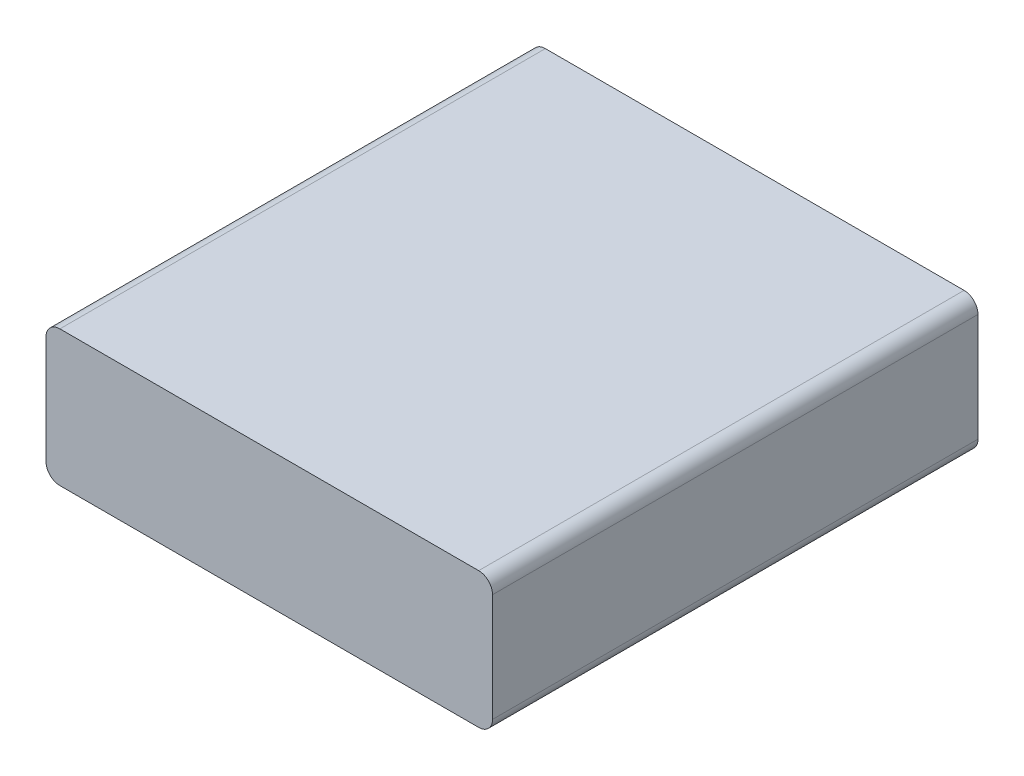
ISO-10303-21;
HEADER;
FILE_DESCRIPTION(('STEP AP214'),'2;1');
FILE_NAME('part.step','',(''),(''),'','','');
FILE_SCHEMA(('AUTOMOTIVE_DESIGN { 1 0 10303 214 1 1 1 1 }'));
ENDSEC;
DATA;
#1=APPLICATION_CONTEXT('core data for automotive mechanical design processes');
#2=APPLICATION_PROTOCOL_DEFINITION('international standard','automotive_design',2000,#1);
#3=PRODUCT_CONTEXT('',#1,'mechanical');
#4=PRODUCT('Part','Part','',(#3));
#5=PRODUCT_RELATED_PRODUCT_CATEGORY('part','',(#4));
#6=PRODUCT_DEFINITION_FORMATION('','',#4);
#7=PRODUCT_DEFINITION_CONTEXT('part definition',#1,'design');
#8=PRODUCT_DEFINITION('design','',#6,#7);
#9=PRODUCT_DEFINITION_SHAPE('','',#8);
#10=(LENGTH_UNIT() NAMED_UNIT(*) SI_UNIT(.MILLI.,.METRE.));
#11=(NAMED_UNIT(*) PLANE_ANGLE_UNIT() SI_UNIT($,.RADIAN.));
#12=(NAMED_UNIT(*) SI_UNIT($,.STERADIAN.) SOLID_ANGLE_UNIT());
#13=UNCERTAINTY_MEASURE_WITH_UNIT(LENGTH_MEASURE(1.E-05),#10,'distance_accuracy_value','');
#14=(GEOMETRIC_REPRESENTATION_CONTEXT(3) GLOBAL_UNCERTAINTY_ASSIGNED_CONTEXT((#13)) GLOBAL_UNIT_ASSIGNED_CONTEXT((#10,
#11,#12)) REPRESENTATION_CONTEXT('',''));
#15=CARTESIAN_POINT('',(0.,0.,0.));
#16=DIRECTION('',(0.,0.,1.));
#17=DIRECTION('',(1.,0.,0.));
#18=AXIS2_PLACEMENT_3D('',#15,#16,#17);
#19=CARTESIAN_POINT('',(32.15,9.775,69.9));
#20=DIRECTION('',(-1.,0.,0.));
#21=DIRECTION('',(0.,0.,1.));
#22=AXIS2_PLACEMENT_3D('',#19,#20,#21);
#23=PLANE('',#22);
#24=DIRECTION('',(0.,1.,0.));
#25=VECTOR('',#24,1.);
#26=CARTESIAN_POINT('',(32.15,9.775,69.9));
#27=LINE('',#26,#25);
#28=CARTESIAN_POINT('',(32.15,-7.775,69.9));
#29=VERTEX_POINT('',#28);
#30=CARTESIAN_POINT('',(32.15,7.775,69.9));
#31=VERTEX_POINT('',#30);
#32=EDGE_CURVE('E127',#29,#31,#27,.T.);
#33=ORIENTED_EDGE('',*,*,#32,.F.);
#34=DIRECTION('',(0.,0.,-1.));
#35=VECTOR('',#34,1.);
#36=CARTESIAN_POINT('',(32.15,-7.775,69.9));
#37=LINE('',#36,#35);
#38=CARTESIAN_POINT('',(32.15,-7.775,0.));
#39=VERTEX_POINT('',#38);
#40=EDGE_CURVE('E112',#29,#39,#37,.T.);
#41=ORIENTED_EDGE('',*,*,#40,.T.);
#42=DIRECTION('',(0.,1.,0.));
#43=VECTOR('',#42,1.);
#44=CARTESIAN_POINT('',(32.15,9.775,0.));
#45=LINE('',#44,#43);
#46=CARTESIAN_POINT('',(32.15,7.775,0.));
#47=VERTEX_POINT('',#46);
#48=EDGE_CURVE('E124',#39,#47,#45,.T.);
#49=ORIENTED_EDGE('',*,*,#48,.T.);
#50=DIRECTION('',(0.,0.,-1.));
#51=VECTOR('',#50,1.);
#52=CARTESIAN_POINT('',(32.15,7.775,69.9));
#53=LINE('',#52,#51);
#54=EDGE_CURVE('E129',#47,#31,#53,.F.);
#55=ORIENTED_EDGE('',*,*,#54,.T.);
#56=EDGE_LOOP('',(#33,#41,#49,#55));
#57=FACE_BOUND('',#56,.T.);
#58=ADVANCED_FACE('F42',(#57),#23,.F.);
#59=CARTESIAN_POINT('',(-32.15,9.775,69.9));
#60=DIRECTION('',(0.,-1.,0.));
#61=DIRECTION('',(0.,0.,-1.));
#62=AXIS2_PLACEMENT_3D('',#59,#60,#61);
#63=PLANE('',#62);
#64=DIRECTION('',(-1.,0.,0.));
#65=VECTOR('',#64,1.);
#66=CARTESIAN_POINT('',(-32.15,9.775,0.));
#67=LINE('',#66,#65);
#68=CARTESIAN_POINT('',(30.15,9.775,0.));
#69=VERTEX_POINT('',#68);
#70=CARTESIAN_POINT('',(-30.15,9.775,0.));
#71=VERTEX_POINT('',#70);
#72=EDGE_CURVE('E133',#69,#71,#67,.T.);
#73=ORIENTED_EDGE('',*,*,#72,.T.);
#74=DIRECTION('',(0.,0.,-1.));
#75=VECTOR('',#74,1.);
#76=CARTESIAN_POINT('',(-30.15,9.775,69.9));
#77=LINE('',#76,#75);
#78=CARTESIAN_POINT('',(-30.15,9.775,69.9));
#79=VERTEX_POINT('',#78);
#80=EDGE_CURVE('E11',#71,#79,#77,.F.);
#81=ORIENTED_EDGE('',*,*,#80,.T.);
#82=DIRECTION('',(-1.,0.,0.));
#83=VECTOR('',#82,1.);
#84=CARTESIAN_POINT('',(-32.15,9.775,69.9));
#85=LINE('',#84,#83);
#86=CARTESIAN_POINT('',(30.15,9.775,69.9));
#87=VERTEX_POINT('',#86);
#88=EDGE_CURVE('E169',#87,#79,#85,.T.);
#89=ORIENTED_EDGE('',*,*,#88,.F.);
#90=DIRECTION('',(0.,0.,-1.));
#91=VECTOR('',#90,1.);
#92=CARTESIAN_POINT('',(30.15,9.775,69.9));
#93=LINE('',#92,#91);
#94=EDGE_CURVE('E50',#87,#69,#93,.T.);
#95=ORIENTED_EDGE('',*,*,#94,.T.);
#96=EDGE_LOOP('',(#73,#81,#89,#95));
#97=FACE_BOUND('',#96,.T.);
#98=ADVANCED_FACE('F167',(#97),#63,.F.);
#99=CARTESIAN_POINT('',(-32.15,9.775,69.9));
#100=DIRECTION('',(1.,0.,0.));
#101=DIRECTION('',(0.,1.,0.));
#102=AXIS2_PLACEMENT_3D('',#99,#100,#101);
#103=PLANE('',#102);
#104=DIRECTION('',(0.,-1.,0.));
#105=VECTOR('',#104,1.);
#106=CARTESIAN_POINT('',(-32.15,9.775,0.));
#107=LINE('',#106,#105);
#108=CARTESIAN_POINT('',(-32.15,7.775,0.));
#109=VERTEX_POINT('',#108);
#110=CARTESIAN_POINT('',(-32.15,-7.775,0.));
#111=VERTEX_POINT('',#110);
#112=EDGE_CURVE('E136',#109,#111,#107,.T.);
#113=ORIENTED_EDGE('',*,*,#112,.T.);
#114=DIRECTION('',(0.,0.,-1.));
#115=VECTOR('',#114,1.);
#116=CARTESIAN_POINT('',(-32.15,-7.775,69.9));
#117=LINE('',#116,#115);
#118=CARTESIAN_POINT('',(-32.15,-7.775,69.9));
#119=VERTEX_POINT('',#118);
#120=EDGE_CURVE('E57',#111,#119,#117,.F.);
#121=ORIENTED_EDGE('',*,*,#120,.T.);
#122=DIRECTION('',(0.,-1.,0.));
#123=VECTOR('',#122,1.);
#124=CARTESIAN_POINT('',(-32.15,9.775,69.9));
#125=LINE('',#124,#123);
#126=CARTESIAN_POINT('',(-32.15,7.775,69.9));
#127=VERTEX_POINT('',#126);
#128=EDGE_CURVE('E177',#127,#119,#125,.T.);
#129=ORIENTED_EDGE('',*,*,#128,.F.);
#130=DIRECTION('',(0.,0.,-1.));
#131=VECTOR('',#130,1.);
#132=CARTESIAN_POINT('',(-32.15,7.775,69.9));
#133=LINE('',#132,#131);
#134=EDGE_CURVE('E160',#127,#109,#133,.T.);
#135=ORIENTED_EDGE('',*,*,#134,.T.);
#136=EDGE_LOOP('',(#113,#121,#129,#135));
#137=FACE_BOUND('',#136,.T.);
#138=ADVANCED_FACE('F176',(#137),#103,.F.);
#139=CARTESIAN_POINT('',(-32.15,-9.775,69.9));
#140=DIRECTION('',(0.,1.,0.));
#141=DIRECTION('',(0.,0.,1.));
#142=AXIS2_PLACEMENT_3D('',#139,#140,#141);
#143=PLANE('',#142);
#144=DIRECTION('',(1.,0.,0.));
#145=VECTOR('',#144,1.);
#146=CARTESIAN_POINT('',(-32.15,-9.775,0.));
#147=LINE('',#146,#145);
#148=CARTESIAN_POINT('',(-30.15,-9.775,0.));
#149=VERTEX_POINT('',#148);
#150=CARTESIAN_POINT('',(30.15,-9.775,0.));
#151=VERTEX_POINT('',#150);
#152=EDGE_CURVE('E143',#149,#151,#147,.T.);
#153=ORIENTED_EDGE('',*,*,#152,.T.);
#154=DIRECTION('',(0.,0.,-1.));
#155=VECTOR('',#154,1.);
#156=CARTESIAN_POINT('',(30.15,-9.775,69.9));
#157=LINE('',#156,#155);
#158=CARTESIAN_POINT('',(30.15,-9.775,69.9));
#159=VERTEX_POINT('',#158);
#160=EDGE_CURVE('E113',#151,#159,#157,.F.);
#161=ORIENTED_EDGE('',*,*,#160,.T.);
#162=DIRECTION('',(1.,0.,0.));
#163=VECTOR('',#162,1.);
#164=CARTESIAN_POINT('',(-32.15,-9.775,69.9));
#165=LINE('',#164,#163);
#166=CARTESIAN_POINT('',(-30.15,-9.775,69.9));
#167=VERTEX_POINT('',#166);
#168=EDGE_CURVE('E139',#167,#159,#165,.T.);
#169=ORIENTED_EDGE('',*,*,#168,.F.);
#170=DIRECTION('',(0.,0.,-1.));
#171=VECTOR('',#170,1.);
#172=CARTESIAN_POINT('',(-30.15,-9.775,69.9));
#173=LINE('',#172,#171);
#174=EDGE_CURVE('E118',#167,#149,#173,.T.);
#175=ORIENTED_EDGE('',*,*,#174,.T.);
#176=EDGE_LOOP('',(#153,#161,#169,#175));
#177=FACE_BOUND('',#176,.T.);
#178=ADVANCED_FACE('F205',(#177),#143,.F.);
#179=CARTESIAN_POINT('',(0.,0.,69.9));
#180=DIRECTION('',(0.,0.,1.));
#181=DIRECTION('',(1.,0.,0.));
#182=AXIS2_PLACEMENT_3D('',#179,#180,#181);
#183=PLANE('',#182);
#184=ORIENTED_EDGE('',*,*,#168,.T.);
#185=CARTESIAN_POINT('',(30.15,-7.775,69.9));
#186=DIRECTION('',(0.,0.,1.));
#187=DIRECTION('',(1.,0.,0.));
#188=AXIS2_PLACEMENT_3D('',#185,#186,#187);
#189=CIRCLE('',#188,2.);
#190=EDGE_CURVE('E158',#159,#29,#189,.T.);
#191=ORIENTED_EDGE('',*,*,#190,.T.);
#192=ORIENTED_EDGE('',*,*,#32,.T.);
#193=CARTESIAN_POINT('',(30.15,7.775,69.9));
#194=DIRECTION('',(0.,0.,1.));
#195=DIRECTION('',(1.,0.,0.));
#196=AXIS2_PLACEMENT_3D('',#193,#194,#195);
#197=CIRCLE('',#196,2.);
#198=EDGE_CURVE('E153',#31,#87,#197,.T.);
#199=ORIENTED_EDGE('',*,*,#198,.T.);
#200=ORIENTED_EDGE('',*,*,#88,.T.);
#201=CARTESIAN_POINT('',(-30.15,7.775,69.9));
#202=DIRECTION('',(0.,0.,1.));
#203=DIRECTION('',(1.,0.,0.));
#204=AXIS2_PLACEMENT_3D('',#201,#202,#203);
#205=CIRCLE('',#204,2.);
#206=EDGE_CURVE('E64',#79,#127,#205,.T.);
#207=ORIENTED_EDGE('',*,*,#206,.T.);
#208=ORIENTED_EDGE('',*,*,#128,.T.);
#209=CARTESIAN_POINT('',(-30.15,-7.775,69.9));
#210=DIRECTION('',(0.,0.,1.));
#211=DIRECTION('',(1.,0.,0.));
#212=AXIS2_PLACEMENT_3D('',#209,#210,#211);
#213=CIRCLE('',#212,2.);
#214=EDGE_CURVE('E156',#119,#167,#213,.T.);
#215=ORIENTED_EDGE('',*,*,#214,.T.);
#216=EDGE_LOOP('',(#184,#191,#192,#199,#200,#207,#208,#215));
#217=FACE_BOUND('',#216,.T.);
#218=ADVANCED_FACE('F182',(#217),#183,.T.);
#219=CARTESIAN_POINT('',(0.,0.,0.));
#220=DIRECTION('',(0.,0.,1.));
#221=DIRECTION('',(1.,0.,0.));
#222=AXIS2_PLACEMENT_3D('',#219,#220,#221);
#223=PLANE('',#222);
#224=ORIENTED_EDGE('',*,*,#48,.F.);
#225=CARTESIAN_POINT('',(30.15,-7.775,0.));
#226=DIRECTION('',(0.,0.,1.));
#227=DIRECTION('',(1.,0.,0.));
#228=AXIS2_PLACEMENT_3D('',#225,#226,#227);
#229=CIRCLE('',#228,2.);
#230=EDGE_CURVE('E108',#39,#151,#229,.F.);
#231=ORIENTED_EDGE('',*,*,#230,.T.);
#232=ORIENTED_EDGE('',*,*,#152,.F.);
#233=CARTESIAN_POINT('',(-30.15,-7.775,0.));
#234=DIRECTION('',(0.,0.,1.));
#235=DIRECTION('',(1.,0.,0.));
#236=AXIS2_PLACEMENT_3D('',#233,#234,#235);
#237=CIRCLE('',#236,2.);
#238=EDGE_CURVE('E119',#149,#111,#237,.F.);
#239=ORIENTED_EDGE('',*,*,#238,.T.);
#240=ORIENTED_EDGE('',*,*,#112,.F.);
#241=CARTESIAN_POINT('',(-30.15,7.775,0.));
#242=DIRECTION('',(0.,0.,1.));
#243=DIRECTION('',(1.,0.,0.));
#244=AXIS2_PLACEMENT_3D('',#241,#242,#243);
#245=CIRCLE('',#244,2.);
#246=EDGE_CURVE('E147',#109,#71,#245,.F.);
#247=ORIENTED_EDGE('',*,*,#246,.T.);
#248=ORIENTED_EDGE('',*,*,#72,.F.);
#249=CARTESIAN_POINT('',(30.15,7.775,0.));
#250=DIRECTION('',(0.,0.,1.));
#251=DIRECTION('',(1.,0.,0.));
#252=AXIS2_PLACEMENT_3D('',#249,#250,#251);
#253=CIRCLE('',#252,2.);
#254=EDGE_CURVE('E128',#69,#47,#253,.F.);
#255=ORIENTED_EDGE('',*,*,#254,.T.);
#256=EDGE_LOOP('',(#224,#231,#232,#239,#240,#247,#248,#255));
#257=FACE_BOUND('',#256,.T.);
#258=ADVANCED_FACE('F131',(#257),#223,.F.);
#259=CARTESIAN_POINT('',(30.15,-7.775,69.9));
#260=DIRECTION('',(0.,0.,-1.));
#261=DIRECTION('',(-1.,0.,0.));
#262=AXIS2_PLACEMENT_3D('',#259,#260,#261);
#263=CYLINDRICAL_SURFACE('',#262,2.);
#264=ORIENTED_EDGE('',*,*,#190,.F.);
#265=ORIENTED_EDGE('',*,*,#160,.F.);
#266=ORIENTED_EDGE('',*,*,#230,.F.);
#267=ORIENTED_EDGE('',*,*,#40,.F.);
#268=EDGE_LOOP('',(#264,#265,#266,#267));
#269=FACE_BOUND('',#268,.T.);
#270=ADVANCED_FACE('F111',(#269),#263,.T.);
#271=CARTESIAN_POINT('',(-30.15,-7.775,69.9));
#272=DIRECTION('',(0.,0.,-1.));
#273=DIRECTION('',(-1.,0.,0.));
#274=AXIS2_PLACEMENT_3D('',#271,#272,#273);
#275=CYLINDRICAL_SURFACE('',#274,2.);
#276=ORIENTED_EDGE('',*,*,#214,.F.);
#277=ORIENTED_EDGE('',*,*,#120,.F.);
#278=ORIENTED_EDGE('',*,*,#238,.F.);
#279=ORIENTED_EDGE('',*,*,#174,.F.);
#280=EDGE_LOOP('',(#276,#277,#278,#279));
#281=FACE_BOUND('',#280,.T.);
#282=ADVANCED_FACE('F187',(#281),#275,.T.);
#283=CARTESIAN_POINT('',(-30.15,7.775,69.9));
#284=DIRECTION('',(0.,0.,-1.));
#285=DIRECTION('',(-1.,0.,0.));
#286=AXIS2_PLACEMENT_3D('',#283,#284,#285);
#287=CYLINDRICAL_SURFACE('',#286,2.);
#288=ORIENTED_EDGE('',*,*,#206,.F.);
#289=ORIENTED_EDGE('',*,*,#80,.F.);
#290=ORIENTED_EDGE('',*,*,#246,.F.);
#291=ORIENTED_EDGE('',*,*,#134,.F.);
#292=EDGE_LOOP('',(#288,#289,#290,#291));
#293=FACE_BOUND('',#292,.T.);
#294=ADVANCED_FACE('F175',(#293),#287,.T.);
#295=CARTESIAN_POINT('',(30.15,7.775,69.9));
#296=DIRECTION('',(0.,0.,-1.));
#297=DIRECTION('',(-1.,0.,0.));
#298=AXIS2_PLACEMENT_3D('',#295,#296,#297);
#299=CYLINDRICAL_SURFACE('',#298,2.);
#300=ORIENTED_EDGE('',*,*,#198,.F.);
#301=ORIENTED_EDGE('',*,*,#54,.F.);
#302=ORIENTED_EDGE('',*,*,#254,.F.);
#303=ORIENTED_EDGE('',*,*,#94,.F.);
#304=EDGE_LOOP('',(#300,#301,#302,#303));
#305=FACE_BOUND('',#304,.T.);
#306=ADVANCED_FACE('F44',(#305),#299,.T.);
#307=CLOSED_SHELL('',(#58,#98,#138,#178,#218,#258,#270,#282,#294,#306));
#308=MANIFOLD_SOLID_BREP('B2',#307);
#309=ADVANCED_BREP_SHAPE_REPRESENTATION('',(#18,#308),#14);
#310=SHAPE_DEFINITION_REPRESENTATION(#9,#309);
ENDSEC;
END-ISO-10303-21;
